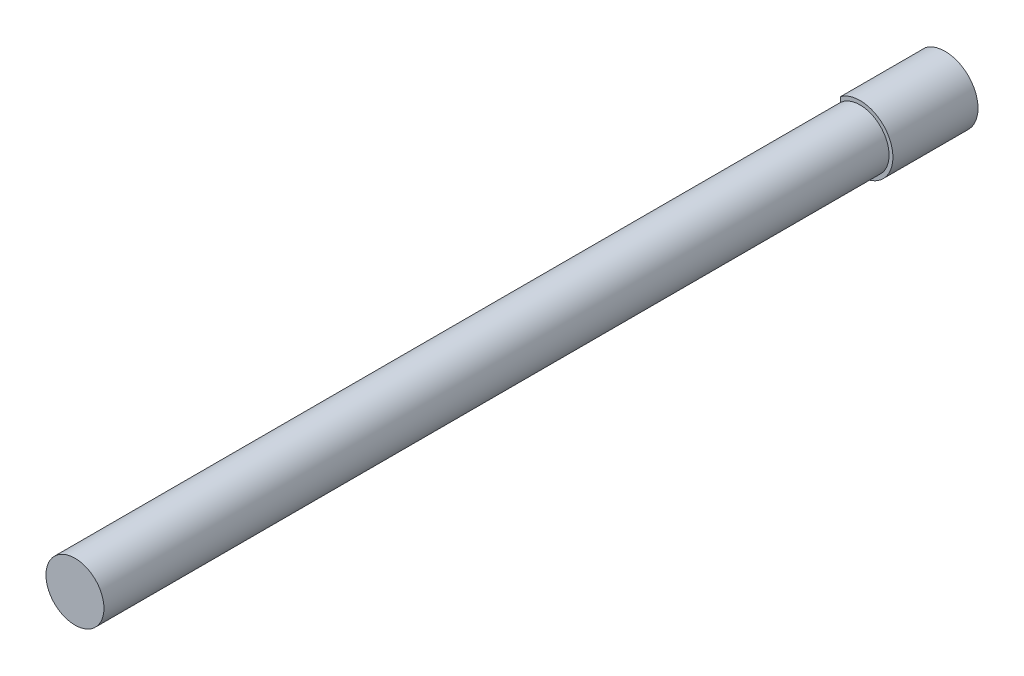
ISO-10303-21;
HEADER;
FILE_DESCRIPTION(('STEP AP214'),'2;1');
FILE_NAME('part.step','',(''),(''),'','','');
FILE_SCHEMA(('AUTOMOTIVE_DESIGN { 1 0 10303 214 1 1 1 1 }'));
ENDSEC;
DATA;
#1=APPLICATION_CONTEXT('core data for automotive mechanical design processes');
#2=APPLICATION_PROTOCOL_DEFINITION('international standard','automotive_design',2000,#1);
#3=PRODUCT_CONTEXT('',#1,'mechanical');
#4=PRODUCT('Part','Part','',(#3));
#5=PRODUCT_RELATED_PRODUCT_CATEGORY('part','',(#4));
#6=PRODUCT_DEFINITION_FORMATION('','',#4);
#7=PRODUCT_DEFINITION_CONTEXT('part definition',#1,'design');
#8=PRODUCT_DEFINITION('design','',#6,#7);
#9=PRODUCT_DEFINITION_SHAPE('','',#8);
#10=(LENGTH_UNIT() NAMED_UNIT(*) SI_UNIT(.MILLI.,.METRE.));
#11=(NAMED_UNIT(*) PLANE_ANGLE_UNIT() SI_UNIT($,.RADIAN.));
#12=(NAMED_UNIT(*) SI_UNIT($,.STERADIAN.) SOLID_ANGLE_UNIT());
#13=UNCERTAINTY_MEASURE_WITH_UNIT(LENGTH_MEASURE(1.E-05),#10,'distance_accuracy_value','');
#14=(GEOMETRIC_REPRESENTATION_CONTEXT(3) GLOBAL_UNCERTAINTY_ASSIGNED_CONTEXT((#13)) GLOBAL_UNIT_ASSIGNED_CONTEXT((#10,
#11,#12)) REPRESENTATION_CONTEXT('',''));
#15=CARTESIAN_POINT('',(0.,0.,0.));
#16=DIRECTION('',(0.,0.,1.));
#17=DIRECTION('',(1.,0.,0.));
#18=AXIS2_PLACEMENT_3D('',#15,#16,#17);
#19=CARTESIAN_POINT('',(0.,0.,10.));
#20=DIRECTION('',(0.,0.,-1.));
#21=DIRECTION('',(-1.,0.,0.));
#22=AXIS2_PLACEMENT_3D('',#19,#20,#21);
#23=CYLINDRICAL_SURFACE('',#22,4.25);
#24=CARTESIAN_POINT('',(0.,0.,10.));
#25=DIRECTION('',(0.,0.,1.));
#26=DIRECTION('',(1.,0.,0.));
#27=AXIS2_PLACEMENT_3D('',#24,#25,#26);
#28=CIRCLE('',#27,4.25);
#29=CARTESIAN_POINT('',(-2.5,3.43693177121688,10.));
#30=VERTEX_POINT('',#29);
#31=CARTESIAN_POINT('',(-2.5,-3.43693177121688,10.));
#32=VERTEX_POINT('',#31);
#33=EDGE_CURVE('E76',#30,#32,#28,.F.);
#34=ORIENTED_EDGE('',*,*,#33,.T.);
#35=DIRECTION('',(0.,0.,-1.));
#36=VECTOR('',#35,1.);
#37=CARTESIAN_POINT('',(-2.5,-3.43693177121688,10.));
#38=LINE('',#37,#36);
#39=CARTESIAN_POINT('',(-2.5,-3.43693177121688,-1.));
#40=VERTEX_POINT('',#39);
#41=EDGE_CURVE('E44',#32,#40,#38,.T.);
#42=ORIENTED_EDGE('',*,*,#41,.T.);
#43=CARTESIAN_POINT('',(0.,0.,-1.));
#44=DIRECTION('',(0.,0.,-1.));
#45=DIRECTION('',(-1.,0.,0.));
#46=AXIS2_PLACEMENT_3D('',#43,#44,#45);
#47=CIRCLE('',#46,4.25);
#48=CARTESIAN_POINT('',(-2.5,3.43693177121688,-1.));
#49=VERTEX_POINT('',#48);
#50=EDGE_CURVE('E83',#49,#40,#47,.T.);
#51=ORIENTED_EDGE('',*,*,#50,.F.);
#52=DIRECTION('',(0.,0.,-1.));
#53=VECTOR('',#52,1.);
#54=CARTESIAN_POINT('',(-2.5,3.43693177121688,10.));
#55=LINE('',#54,#53);
#56=EDGE_CURVE('E11',#30,#49,#55,.T.);
#57=ORIENTED_EDGE('',*,*,#56,.F.);
#58=EDGE_LOOP('',(#34,#42,#51,#57));
#59=FACE_BOUND('',#58,.T.);
#60=ADVANCED_FACE('F35',(#59),#23,.T.);
#61=CARTESIAN_POINT('',(0.,0.,10.));
#62=DIRECTION('',(0.,0.,1.));
#63=DIRECTION('',(1.,0.,0.));
#64=AXIS2_PLACEMENT_3D('',#61,#62,#63);
#65=PLANE('',#64);
#66=CARTESIAN_POINT('',(0.,0.,10.));
#67=DIRECTION('',(0.,0.,1.));
#68=DIRECTION('',(1.,0.,0.));
#69=AXIS2_PLACEMENT_3D('',#66,#67,#68);
#70=CIRCLE('',#69,3.75);
#71=CARTESIAN_POINT('',(-2.5,-2.79508497187474,10.));
#72=VERTEX_POINT('',#71);
#73=CARTESIAN_POINT('',(-2.5,2.79508497187473,10.));
#74=VERTEX_POINT('',#73);
#75=EDGE_CURVE('E75',#72,#74,#70,.F.);
#76=ORIENTED_EDGE('',*,*,#75,.T.);
#77=DIRECTION('',(0.,-1.,0.));
#78=VECTOR('',#77,1.);
#79=CARTESIAN_POINT('',(-2.5,3.43693177121688,10.));
#80=LINE('',#79,#78);
#81=EDGE_CURVE('E86',#74,#72,#80,.T.);
#82=ORIENTED_EDGE('',*,*,#81,.T.);
#83=EDGE_LOOP('',(#76,#82));
#84=FACE_BOUND('',#83,.T.);
#85=ADVANCED_FACE('F88',(#84),#65,.F.);
#86=CARTESIAN_POINT('',(-2.5,3.43693177121688,10.));
#87=DIRECTION('',(1.,0.,0.));
#88=DIRECTION('',(0.,0.,-1.));
#89=AXIS2_PLACEMENT_3D('',#86,#87,#88);
#90=PLANE('',#89);
#91=ORIENTED_EDGE('',*,*,#56,.T.);
#92=DIRECTION('',(0.,1.,0.));
#93=VECTOR('',#92,1.);
#94=CARTESIAN_POINT('',(-2.5,-3.43693177121688,-1.));
#95=LINE('',#94,#93);
#96=EDGE_CURVE('E87',#40,#49,#95,.T.);
#97=ORIENTED_EDGE('',*,*,#96,.F.);
#98=ORIENTED_EDGE('',*,*,#41,.F.);
#99=EDGE_CURVE('E38',#72,#32,#80,.T.);
#100=ORIENTED_EDGE('',*,*,#99,.F.);
#101=ORIENTED_EDGE('',*,*,#81,.F.);
#102=EDGE_CURVE('E73',#30,#74,#80,.T.);
#103=ORIENTED_EDGE('',*,*,#102,.F.);
#104=EDGE_LOOP('',(#91,#97,#98,#100,#101,#103));
#105=FACE_BOUND('',#104,.T.);
#106=ADVANCED_FACE('F85',(#105),#90,.F.);
#107=CARTESIAN_POINT('',(0.,0.,-1.));
#108=DIRECTION('',(0.,0.,-1.));
#109=DIRECTION('',(-1.,0.,0.));
#110=AXIS2_PLACEMENT_3D('',#107,#108,#109);
#111=PLANE('',#110);
#112=ORIENTED_EDGE('',*,*,#50,.T.);
#113=ORIENTED_EDGE('',*,*,#96,.T.);
#114=EDGE_LOOP('',(#112,#113));
#115=FACE_BOUND('',#114,.T.);
#116=ADVANCED_FACE('F104',(#115),#111,.T.);
#117=CARTESIAN_POINT('',(0.,0.,10.));
#118=DIRECTION('',(0.,0.,1.));
#119=DIRECTION('',(1.,0.,0.));
#120=AXIS2_PLACEMENT_3D('',#117,#118,#119);
#121=PLANE('',#120);
#122=ORIENTED_EDGE('',*,*,#102,.T.);
#123=EDGE_CURVE('E51',#74,#72,#70,.F.);
#124=ORIENTED_EDGE('',*,*,#123,.T.);
#125=ORIENTED_EDGE('',*,*,#99,.T.);
#126=ORIENTED_EDGE('',*,*,#33,.F.);
#127=EDGE_LOOP('',(#122,#124,#125,#126));
#128=FACE_BOUND('',#127,.T.);
#129=ADVANCED_FACE('F70',(#128),#121,.T.);
#130=CARTESIAN_POINT('',(0.,0.,-2.02081528017131));
#131=DIRECTION('',(0.,0.,1.));
#132=DIRECTION('',(1.,0.,0.));
#133=AXIS2_PLACEMENT_3D('',#130,#131,#132);
#134=CYLINDRICAL_SURFACE('',#133,3.75);
#135=ORIENTED_EDGE('',*,*,#75,.F.);
#136=ORIENTED_EDGE('',*,*,#123,.F.);
#137=EDGE_LOOP('',(#135,#136));
#138=FACE_BOUND('',#137,.T.);
#139=CARTESIAN_POINT('',(0.,0.,111.5));
#140=DIRECTION('',(0.,0.,1.));
#141=DIRECTION('',(1.,0.,0.));
#142=AXIS2_PLACEMENT_3D('',#139,#140,#141);
#143=CIRCLE('',#142,3.75);
#144=CARTESIAN_POINT('',(3.75,0.,111.5));
#145=VERTEX_POINT('',#144);
#146=EDGE_CURVE('E107',#145,#145,#143,.T.);
#147=ORIENTED_EDGE('',*,*,#146,.F.);
#148=EDGE_LOOP('',(#147));
#149=FACE_BOUND('',#148,.T.);
#150=ADVANCED_FACE('F78',(#138,#149),#134,.T.);
#151=CARTESIAN_POINT('',(0.,0.,111.5));
#152=DIRECTION('',(0.,0.,1.));
#153=DIRECTION('',(1.,0.,0.));
#154=AXIS2_PLACEMENT_3D('',#151,#152,#153);
#155=PLANE('',#154);
#156=ORIENTED_EDGE('',*,*,#146,.T.);
#157=EDGE_LOOP('',(#156));
#158=FACE_BOUND('',#157,.T.);
#159=ADVANCED_FACE('F113',(#158),#155,.T.);
#160=CLOSED_SHELL('',(#60,#85,#106,#116,#129,#150,#159));
#161=MANIFOLD_SOLID_BREP('B2',#160);
#162=ADVANCED_BREP_SHAPE_REPRESENTATION('',(#18,#161),#14);
#163=SHAPE_DEFINITION_REPRESENTATION(#9,#162);
ENDSEC;
END-ISO-10303-21;
